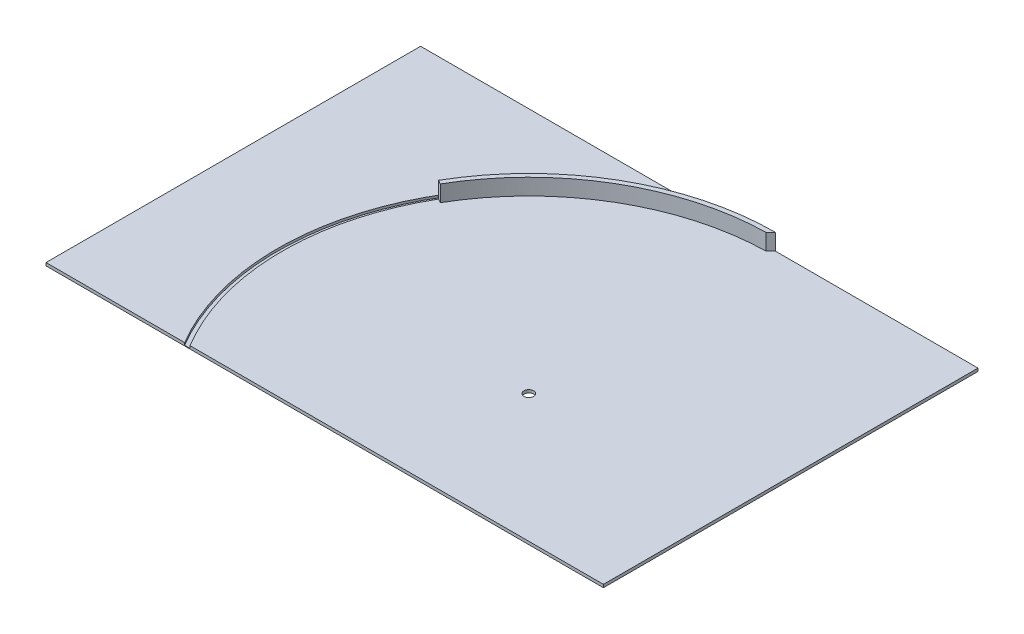
ISO-10303-21;
HEADER;
FILE_DESCRIPTION(('STEP AP214'),'2;1');
FILE_NAME('part.step','',(''),(''),'','','');
FILE_SCHEMA(('AUTOMOTIVE_DESIGN { 1 0 10303 214 1 1 1 1 }'));
ENDSEC;
DATA;
#1=APPLICATION_CONTEXT('core data for automotive mechanical design processes');
#2=APPLICATION_PROTOCOL_DEFINITION('international standard','automotive_design',2000,#1);
#3=PRODUCT_CONTEXT('',#1,'mechanical');
#4=PRODUCT('Part','Part','',(#3));
#5=PRODUCT_RELATED_PRODUCT_CATEGORY('part','',(#4));
#6=PRODUCT_DEFINITION_FORMATION('','',#4);
#7=PRODUCT_DEFINITION_CONTEXT('part definition',#1,'design');
#8=PRODUCT_DEFINITION('design','',#6,#7);
#9=PRODUCT_DEFINITION_SHAPE('','',#8);
#10=(LENGTH_UNIT() NAMED_UNIT(*) SI_UNIT(.MILLI.,.METRE.));
#11=(NAMED_UNIT(*) PLANE_ANGLE_UNIT() SI_UNIT($,.RADIAN.));
#12=(NAMED_UNIT(*) SI_UNIT($,.STERADIAN.) SOLID_ANGLE_UNIT());
#13=UNCERTAINTY_MEASURE_WITH_UNIT(LENGTH_MEASURE(1.E-05),#10,'distance_accuracy_value','');
#14=(GEOMETRIC_REPRESENTATION_CONTEXT(3) GLOBAL_UNCERTAINTY_ASSIGNED_CONTEXT((#13)) GLOBAL_UNIT_ASSIGNED_CONTEXT((#10,
#11,#12)) REPRESENTATION_CONTEXT('',''));
#15=CARTESIAN_POINT('',(0.,0.,0.));
#16=DIRECTION('',(0.,0.,1.));
#17=DIRECTION('',(1.,0.,0.));
#18=AXIS2_PLACEMENT_3D('',#15,#16,#17);
#19=CARTESIAN_POINT('',(0.,0.,0.));
#20=DIRECTION('',(0.,-1.,0.));
#21=DIRECTION('',(0.,0.,-1.));
#22=AXIS2_PLACEMENT_3D('',#19,#20,#21);
#23=PLANE('',#22);
#24=CARTESIAN_POINT('',(0.,0.,0.));
#25=DIRECTION('',(0.,1.,0.));
#26=DIRECTION('',(0.,0.,1.));
#27=AXIS2_PLACEMENT_3D('',#24,#25,#26);
#28=CIRCLE('',#27,10.5);
#29=CARTESIAN_POINT('',(0.,0.,10.5));
#30=VERTEX_POINT('',#29);
#31=EDGE_CURVE('E162',#30,#30,#28,.T.);
#32=ORIENTED_EDGE('',*,*,#31,.F.);
#33=EDGE_LOOP('',(#32));
#34=FACE_BOUND('',#33,.T.);
#35=DIRECTION('',(0.866025403784446,0.,0.499999999999987));
#36=VECTOR('',#35,1.);
#37=CARTESIAN_POINT('',(-459.859489409537,0.,-265.5));
#38=LINE('',#37,#36);
#39=CARTESIAN_POINT('',(-459.859489409537,0.,-265.5));
#40=VERTEX_POINT('',#39);
#41=CARTESIAN_POINT('',(-451.199235371692,0.,-260.5));
#42=VERTEX_POINT('',#41);
#43=EDGE_CURVE('E229',#40,#42,#38,.T.);
#44=ORIENTED_EDGE('',*,*,#43,.F.);
#45=CARTESIAN_POINT('',(0.,0.,0.));
#46=DIRECTION('',(0.,-1.,0.));
#47=DIRECTION('',(0.,0.,1.));
#48=AXIS2_PLACEMENT_3D('',#45,#46,#47);
#49=CIRCLE('',#48,531.);
#50=CARTESIAN_POINT('',(-453.999823788512,0.,275.4));
#51=VERTEX_POINT('',#50);
#52=EDGE_CURVE('E266',#51,#40,#49,.T.);
#53=ORIENTED_EDGE('',*,*,#52,.F.);
#54=DIRECTION('',(1.,0.,0.));
#55=VECTOR('',#54,1.);
#56=CARTESIAN_POINT('',(-764.07,0.,275.4));
#57=LINE('',#56,#55);
#58=CARTESIAN_POINT('',(435.93,0.,275.4));
#59=VERTEX_POINT('',#58);
#60=EDGE_CURVE('E198',#51,#59,#57,.T.);
#61=ORIENTED_EDGE('',*,*,#60,.T.);
#62=DIRECTION('',(0.,0.,-1.));
#63=VECTOR('',#62,1.);
#64=CARTESIAN_POINT('',(435.93,0.,275.4));
#65=LINE('',#64,#63);
#66=CARTESIAN_POINT('',(435.93,0.,-531.));
#67=VERTEX_POINT('',#66);
#68=EDGE_CURVE('E203',#59,#67,#65,.T.);
#69=ORIENTED_EDGE('',*,*,#68,.T.);
#70=DIRECTION('',(-1.,0.,0.));
#71=VECTOR('',#70,1.);
#72=CARTESIAN_POINT('',(-764.07,0.,-531.));
#73=LINE('',#72,#71);
#74=CARTESIAN_POINT('',(0.,0.,-531.));
#75=VERTEX_POINT('',#74);
#76=EDGE_CURVE('E182',#67,#75,#73,.T.);
#77=ORIENTED_EDGE('',*,*,#76,.T.);
#78=DIRECTION('',(0.707106781186547,0.,-0.707106781186548));
#79=VECTOR('',#78,1.);
#80=CARTESIAN_POINT('',(-265.5,0.,-265.5));
#81=LINE('',#80,#79);
#82=CARTESIAN_POINT('',(-10.0978661013188,0.,-520.902133898681));
#83=VERTEX_POINT('',#82);
#84=EDGE_CURVE('E55',#75,#83,#81,.F.);
#85=ORIENTED_EDGE('',*,*,#84,.T.);
#86=CARTESIAN_POINT('',(0.,0.,0.));
#87=DIRECTION('',(0.,-1.,0.));
#88=DIRECTION('',(0.,0.,1.));
#89=AXIS2_PLACEMENT_3D('',#86,#87,#88);
#90=CIRCLE('',#89,521.);
#91=EDGE_CURVE('E215',#42,#83,#90,.T.);
#92=ORIENTED_EDGE('',*,*,#91,.F.);
#93=EDGE_LOOP('',(#44,#53,#61,#69,#77,#85,#92));
#94=FACE_BOUND('',#93,.T.);
#95=ADVANCED_FACE('F45',(#34,#94),#23,.F.);
#96=CARTESIAN_POINT('',(0.,35.,0.));
#97=DIRECTION('',(0.,-1.,0.));
#98=DIRECTION('',(0.,0.,-1.));
#99=AXIS2_PLACEMENT_3D('',#96,#97,#98);
#100=CYLINDRICAL_SURFACE('',#99,521.);
#101=ORIENTED_EDGE('',*,*,#91,.T.);
#102=DIRECTION('',(0.,-1.,0.));
#103=VECTOR('',#102,1.);
#104=CARTESIAN_POINT('',(-10.0978661013188,35.,-520.902133898681));
#105=LINE('',#104,#103);
#106=CARTESIAN_POINT('',(-10.0978661013188,35.,-520.902133898681));
#107=VERTEX_POINT('',#106);
#108=EDGE_CURVE('E70',#83,#107,#105,.F.);
#109=ORIENTED_EDGE('',*,*,#108,.T.);
#110=CARTESIAN_POINT('',(0.,35.,0.));
#111=DIRECTION('',(0.,-1.,0.));
#112=DIRECTION('',(0.,0.,1.));
#113=AXIS2_PLACEMENT_3D('',#110,#111,#112);
#114=CIRCLE('',#113,521.);
#115=CARTESIAN_POINT('',(-451.199235371692,35.,-260.5));
#116=VERTEX_POINT('',#115);
#117=EDGE_CURVE('E225',#116,#107,#114,.T.);
#118=ORIENTED_EDGE('',*,*,#117,.F.);
#119=DIRECTION('',(0.,-1.,0.));
#120=VECTOR('',#119,1.);
#121=CARTESIAN_POINT('',(-451.199235371692,35.,-260.5));
#122=LINE('',#121,#120);
#123=EDGE_CURVE('E235',#116,#42,#122,.T.);
#124=ORIENTED_EDGE('',*,*,#123,.T.);
#125=EDGE_LOOP('',(#101,#109,#118,#124));
#126=FACE_BOUND('',#125,.T.);
#127=ADVANCED_FACE('F258',(#126),#100,.F.);
#128=CARTESIAN_POINT('',(0.,35.,0.));
#129=DIRECTION('',(0.,-1.,0.));
#130=DIRECTION('',(0.,0.,-1.));
#131=AXIS2_PLACEMENT_3D('',#128,#129,#130);
#132=CYLINDRICAL_SURFACE('',#131,531.);
#133=DIRECTION('',(0.,-1.,0.));
#134=VECTOR('',#133,1.);
#135=CARTESIAN_POINT('',(0.,35.,-531.));
#136=LINE('',#135,#134);
#137=CARTESIAN_POINT('',(0.,35.,-531.));
#138=VERTEX_POINT('',#137);
#139=EDGE_CURVE('E143',#138,#75,#136,.T.);
#140=ORIENTED_EDGE('',*,*,#139,.T.);
#141=DIRECTION('',(0.,1.,0.));
#142=VECTOR('',#141,1.);
#143=CARTESIAN_POINT('',(0.,-5.,-531.));
#144=LINE('',#143,#142);
#145=CARTESIAN_POINT('',(0.,-5.,-531.));
#146=VERTEX_POINT('',#145);
#147=EDGE_CURVE('E136',#146,#75,#144,.T.);
#148=ORIENTED_EDGE('',*,*,#147,.F.);
#149=CARTESIAN_POINT('',(0.,-5.,0.));
#150=DIRECTION('',(0.,-1.,0.));
#151=DIRECTION('',(0.,0.,1.));
#152=AXIS2_PLACEMENT_3D('',#149,#150,#151);
#153=CIRCLE('',#152,531.);
#154=CARTESIAN_POINT('',(-453.999823788512,-5.,275.4));
#155=VERTEX_POINT('',#154);
#156=EDGE_CURVE('E139',#155,#146,#153,.T.);
#157=ORIENTED_EDGE('',*,*,#156,.F.);
#158=DIRECTION('',(0.,1.,0.));
#159=VECTOR('',#158,1.);
#160=CARTESIAN_POINT('',(-453.999823788512,-5.,275.4));
#161=LINE('',#160,#159);
#162=EDGE_CURVE('E149',#155,#51,#161,.T.);
#163=ORIENTED_EDGE('',*,*,#162,.T.);
#164=ORIENTED_EDGE('',*,*,#52,.T.);
#165=DIRECTION('',(0.,-1.,0.));
#166=VECTOR('',#165,1.);
#167=CARTESIAN_POINT('',(-459.859489409537,35.,-265.500000000001));
#168=LINE('',#167,#166);
#169=CARTESIAN_POINT('',(-459.859489409537,35.,-265.500000000001));
#170=VERTEX_POINT('',#169);
#171=EDGE_CURVE('E244',#170,#40,#168,.T.);
#172=ORIENTED_EDGE('',*,*,#171,.F.);
#173=CARTESIAN_POINT('',(0.,35.,0.));
#174=DIRECTION('',(0.,1.,0.));
#175=DIRECTION('',(0.,0.,1.));
#176=AXIS2_PLACEMENT_3D('',#173,#174,#175);
#177=CIRCLE('',#176,531.);
#178=EDGE_CURVE('E228',#138,#170,#177,.T.);
#179=ORIENTED_EDGE('',*,*,#178,.F.);
#180=EDGE_LOOP('',(#140,#148,#157,#163,#164,#172,#179));
#181=FACE_BOUND('',#180,.T.);
#182=ADVANCED_FACE('F138',(#181),#132,.T.);
#183=CARTESIAN_POINT('',(-459.859489409537,35.,-265.5));
#184=DIRECTION('',(0.499999999999987,0.,-0.866025403784446));
#185=DIRECTION('',(-0.866025403784446,0.,-0.499999999999987));
#186=AXIS2_PLACEMENT_3D('',#183,#184,#185);
#187=PLANE('',#186);
#188=ORIENTED_EDGE('',*,*,#43,.T.);
#189=ORIENTED_EDGE('',*,*,#123,.F.);
#190=DIRECTION('',(0.866025403784446,0.,0.499999999999987));
#191=VECTOR('',#190,1.);
#192=CARTESIAN_POINT('',(-459.859489409537,35.,-265.5));
#193=LINE('',#192,#191);
#194=EDGE_CURVE('E232',#170,#116,#193,.T.);
#195=ORIENTED_EDGE('',*,*,#194,.F.);
#196=ORIENTED_EDGE('',*,*,#171,.T.);
#197=EDGE_LOOP('',(#188,#189,#195,#196));
#198=FACE_BOUND('',#197,.T.);
#199=ADVANCED_FACE('F268',(#198),#187,.F.);
#200=CARTESIAN_POINT('',(0.,35.,0.));
#201=DIRECTION('',(0.,1.,0.));
#202=DIRECTION('',(0.,0.,1.));
#203=AXIS2_PLACEMENT_3D('',#200,#201,#202);
#204=PLANE('',#203);
#205=ORIENTED_EDGE('',*,*,#117,.T.);
#206=DIRECTION('',(-0.707106781186547,0.,0.707106781186548));
#207=VECTOR('',#206,1.);
#208=CARTESIAN_POINT('',(-265.5,35.,-265.5));
#209=LINE('',#208,#207);
#210=EDGE_CURVE('E252',#107,#138,#209,.F.);
#211=ORIENTED_EDGE('',*,*,#210,.T.);
#212=ORIENTED_EDGE('',*,*,#178,.T.);
#213=ORIENTED_EDGE('',*,*,#194,.T.);
#214=EDGE_LOOP('',(#205,#211,#212,#213));
#215=FACE_BOUND('',#214,.T.);
#216=ADVANCED_FACE('F262',(#215),#204,.T.);
#217=CARTESIAN_POINT('',(-764.07,-6.35,275.4));
#218=DIRECTION('',(-1.,0.,0.));
#219=DIRECTION('',(0.,0.,1.));
#220=AXIS2_PLACEMENT_3D('',#217,#218,#219);
#221=PLANE('',#220);
#222=DIRECTION('',(0.,0.,1.));
#223=VECTOR('',#222,1.);
#224=CARTESIAN_POINT('',(-764.07,0.,275.4));
#225=LINE('',#224,#223);
#226=CARTESIAN_POINT('',(-764.07,0.,-531.));
#227=VERTEX_POINT('',#226);
#228=CARTESIAN_POINT('',(-764.07,0.,275.4));
#229=VERTEX_POINT('',#228);
#230=EDGE_CURVE('E176',#227,#229,#225,.T.);
#231=ORIENTED_EDGE('',*,*,#230,.F.);
#232=DIRECTION('',(0.,1.,0.));
#233=VECTOR('',#232,1.);
#234=CARTESIAN_POINT('',(-764.07,-6.35,-531.));
#235=LINE('',#234,#233);
#236=CARTESIAN_POINT('',(-764.07,-6.35,-531.));
#237=VERTEX_POINT('',#236);
#238=EDGE_CURVE('E211',#237,#227,#235,.T.);
#239=ORIENTED_EDGE('',*,*,#238,.F.);
#240=DIRECTION('',(0.,0.,1.));
#241=VECTOR('',#240,1.);
#242=CARTESIAN_POINT('',(-764.07,-6.35,275.4));
#243=LINE('',#242,#241);
#244=CARTESIAN_POINT('',(-764.07,-6.35,275.4));
#245=VERTEX_POINT('',#244);
#246=EDGE_CURVE('E177',#237,#245,#243,.T.);
#247=ORIENTED_EDGE('',*,*,#246,.T.);
#248=DIRECTION('',(0.,1.,0.));
#249=VECTOR('',#248,1.);
#250=CARTESIAN_POINT('',(-764.07,-6.35,275.4));
#251=LINE('',#250,#249);
#252=EDGE_CURVE('E194',#245,#229,#251,.T.);
#253=ORIENTED_EDGE('',*,*,#252,.T.);
#254=EDGE_LOOP('',(#231,#239,#247,#253));
#255=FACE_BOUND('',#254,.T.);
#256=ADVANCED_FACE('F283',(#255),#221,.T.);
#257=CARTESIAN_POINT('',(-764.07,-6.35,-531.));
#258=DIRECTION('',(0.,0.,-1.));
#259=DIRECTION('',(-1.,0.,0.));
#260=AXIS2_PLACEMENT_3D('',#257,#258,#259);
#261=PLANE('',#260);
#262=DIRECTION('',(0.,1.,0.));
#263=VECTOR('',#262,1.);
#264=CARTESIAN_POINT('',(-103.537432844358,-5.,-531.));
#265=LINE('',#264,#263);
#266=CARTESIAN_POINT('',(-103.537432844358,-5.,-531.));
#267=VERTEX_POINT('',#266);
#268=CARTESIAN_POINT('',(-103.537432844358,0.,-531.));
#269=VERTEX_POINT('',#268);
#270=EDGE_CURVE('E62',#267,#269,#265,.T.);
#271=ORIENTED_EDGE('',*,*,#270,.F.);
#272=DIRECTION('',(1.,0.,0.));
#273=VECTOR('',#272,1.);
#274=CARTESIAN_POINT('',(-764.07,-5.,-531.));
#275=LINE('',#274,#273);
#276=EDGE_CURVE('E155',#267,#146,#275,.T.);
#277=ORIENTED_EDGE('',*,*,#276,.T.);
#278=ORIENTED_EDGE('',*,*,#147,.T.);
#279=ORIENTED_EDGE('',*,*,#76,.F.);
#280=DIRECTION('',(0.,1.,0.));
#281=VECTOR('',#280,1.);
#282=CARTESIAN_POINT('',(435.93,-6.35,-531.));
#283=LINE('',#282,#281);
#284=CARTESIAN_POINT('',(435.93,-6.35,-531.));
#285=VERTEX_POINT('',#284);
#286=EDGE_CURVE('E216',#285,#67,#283,.T.);
#287=ORIENTED_EDGE('',*,*,#286,.F.);
#288=DIRECTION('',(-1.,0.,0.));
#289=VECTOR('',#288,1.);
#290=CARTESIAN_POINT('',(-764.07,-6.35,-531.));
#291=LINE('',#290,#289);
#292=EDGE_CURVE('E190',#285,#237,#291,.T.);
#293=ORIENTED_EDGE('',*,*,#292,.T.);
#294=ORIENTED_EDGE('',*,*,#238,.T.);
#295=EDGE_CURVE('E207',#269,#227,#73,.T.);
#296=ORIENTED_EDGE('',*,*,#295,.F.);
#297=EDGE_LOOP('',(#271,#277,#278,#279,#287,#293,#294,#296));
#298=FACE_BOUND('',#297,.T.);
#299=ADVANCED_FACE('F159',(#298),#261,.T.);
#300=CARTESIAN_POINT('',(435.93,-6.35,275.4));
#301=DIRECTION('',(1.,0.,0.));
#302=DIRECTION('',(0.,0.,-1.));
#303=AXIS2_PLACEMENT_3D('',#300,#301,#302);
#304=PLANE('',#303);
#305=ORIENTED_EDGE('',*,*,#68,.F.);
#306=DIRECTION('',(0.,1.,0.));
#307=VECTOR('',#306,1.);
#308=CARTESIAN_POINT('',(435.93,-6.35,275.4));
#309=LINE('',#308,#307);
#310=CARTESIAN_POINT('',(435.93,-6.35,275.4));
#311=VERTEX_POINT('',#310);
#312=EDGE_CURVE('E219',#311,#59,#309,.T.);
#313=ORIENTED_EDGE('',*,*,#312,.F.);
#314=DIRECTION('',(0.,0.,-1.));
#315=VECTOR('',#314,1.);
#316=CARTESIAN_POINT('',(435.93,-6.35,275.4));
#317=LINE('',#316,#315);
#318=EDGE_CURVE('E186',#311,#285,#317,.T.);
#319=ORIENTED_EDGE('',*,*,#318,.T.);
#320=ORIENTED_EDGE('',*,*,#286,.T.);
#321=EDGE_LOOP('',(#305,#313,#319,#320));
#322=FACE_BOUND('',#321,.T.);
#323=ADVANCED_FACE('F324',(#322),#304,.T.);
#324=CARTESIAN_POINT('',(-764.07,-6.35,275.4));
#325=DIRECTION('',(0.,0.,1.));
#326=DIRECTION('',(1.,0.,0.));
#327=AXIS2_PLACEMENT_3D('',#324,#325,#326);
#328=PLANE('',#327);
#329=ORIENTED_EDGE('',*,*,#162,.F.);
#330=DIRECTION('',(-1.,0.,0.));
#331=VECTOR('',#330,1.);
#332=CARTESIAN_POINT('',(-764.07,-5.,275.4));
#333=LINE('',#332,#331);
#334=CARTESIAN_POINT('',(-465.656353977909,-5.,275.4));
#335=VERTEX_POINT('',#334);
#336=EDGE_CURVE('E11',#155,#335,#333,.T.);
#337=ORIENTED_EDGE('',*,*,#336,.T.);
#338=DIRECTION('',(0.,1.,0.));
#339=VECTOR('',#338,1.);
#340=CARTESIAN_POINT('',(-465.656353977909,-5.,275.4));
#341=LINE('',#340,#339);
#342=CARTESIAN_POINT('',(-465.656353977909,0.,275.4));
#343=VERTEX_POINT('',#342);
#344=EDGE_CURVE('E169',#343,#335,#341,.F.);
#345=ORIENTED_EDGE('',*,*,#344,.F.);
#346=EDGE_CURVE('E199',#229,#343,#57,.T.);
#347=ORIENTED_EDGE('',*,*,#346,.F.);
#348=ORIENTED_EDGE('',*,*,#252,.F.);
#349=DIRECTION('',(1.,0.,0.));
#350=VECTOR('',#349,1.);
#351=CARTESIAN_POINT('',(-764.07,-6.35,275.4));
#352=LINE('',#351,#350);
#353=EDGE_CURVE('E181',#245,#311,#352,.T.);
#354=ORIENTED_EDGE('',*,*,#353,.T.);
#355=ORIENTED_EDGE('',*,*,#312,.T.);
#356=ORIENTED_EDGE('',*,*,#60,.F.);
#357=EDGE_LOOP('',(#329,#337,#345,#347,#348,#354,#355,#356));
#358=FACE_BOUND('',#357,.T.);
#359=ADVANCED_FACE('F273',(#358),#328,.T.);
#360=CARTESIAN_POINT('',(0.,-6.35,0.));
#361=DIRECTION('',(0.,-1.,0.));
#362=DIRECTION('',(0.,0.,-1.));
#363=AXIS2_PLACEMENT_3D('',#360,#361,#362);
#364=PLANE('',#363);
#365=CARTESIAN_POINT('',(0.,-6.35,0.));
#366=DIRECTION('',(0.,1.,0.));
#367=DIRECTION('',(0.,0.,1.));
#368=AXIS2_PLACEMENT_3D('',#365,#366,#367);
#369=CIRCLE('',#368,10.5);
#370=CARTESIAN_POINT('',(0.,-6.35,10.5));
#371=VERTEX_POINT('',#370);
#372=EDGE_CURVE('E167',#371,#371,#369,.T.);
#373=ORIENTED_EDGE('',*,*,#372,.T.);
#374=EDGE_LOOP('',(#373));
#375=FACE_BOUND('',#374,.T.);
#376=ORIENTED_EDGE('',*,*,#246,.F.);
#377=ORIENTED_EDGE('',*,*,#292,.F.);
#378=ORIENTED_EDGE('',*,*,#318,.F.);
#379=ORIENTED_EDGE('',*,*,#353,.F.);
#380=EDGE_LOOP('',(#376,#377,#378,#379));
#381=FACE_BOUND('',#380,.T.);
#382=ADVANCED_FACE('F315',(#375,#381),#364,.T.);
#383=ORIENTED_EDGE('',*,*,#346,.T.);
#384=CARTESIAN_POINT('',(0.,0.,0.));
#385=DIRECTION('',(0.,1.,0.));
#386=DIRECTION('',(0.,0.,1.));
#387=AXIS2_PLACEMENT_3D('',#384,#385,#386);
#388=CIRCLE('',#387,541.);
#389=EDGE_CURVE('E157',#269,#343,#388,.T.);
#390=ORIENTED_EDGE('',*,*,#389,.F.);
#391=ORIENTED_EDGE('',*,*,#295,.T.);
#392=ORIENTED_EDGE('',*,*,#230,.T.);
#393=EDGE_LOOP('',(#383,#390,#391,#392));
#394=FACE_BOUND('',#393,.T.);
#395=ADVANCED_FACE('F278',(#394),#23,.F.);
#396=CARTESIAN_POINT('',(0.,35.,-531.));
#397=DIRECTION('',(-0.707106781186548,0.,-0.707106781186547));
#398=DIRECTION('',(0.,-1.,0.));
#399=AXIS2_PLACEMENT_3D('',#396,#397,#398);
#400=PLANE('',#399);
#401=ORIENTED_EDGE('',*,*,#210,.F.);
#402=ORIENTED_EDGE('',*,*,#108,.F.);
#403=ORIENTED_EDGE('',*,*,#84,.F.);
#404=ORIENTED_EDGE('',*,*,#139,.F.);
#405=EDGE_LOOP('',(#401,#402,#403,#404));
#406=FACE_BOUND('',#405,.T.);
#407=ADVANCED_FACE('F48',(#406),#400,.F.);
#408=CARTESIAN_POINT('',(0.,0.,0.));
#409=DIRECTION('',(0.,1.,0.));
#410=DIRECTION('',(0.,0.,1.));
#411=AXIS2_PLACEMENT_3D('',#408,#409,#410);
#412=CYLINDRICAL_SURFACE('',#411,10.5);
#413=ORIENTED_EDGE('',*,*,#372,.F.);
#414=EDGE_LOOP('',(#413));
#415=FACE_BOUND('',#414,.T.);
#416=ORIENTED_EDGE('',*,*,#31,.T.);
#417=EDGE_LOOP('',(#416));
#418=FACE_BOUND('',#417,.T.);
#419=ADVANCED_FACE('F296',(#415,#418),#412,.F.);
#420=CARTESIAN_POINT('',(0.,-5.,0.));
#421=DIRECTION('',(0.,1.,0.));
#422=DIRECTION('',(0.,0.,1.));
#423=AXIS2_PLACEMENT_3D('',#420,#421,#422);
#424=CYLINDRICAL_SURFACE('',#423,541.);
#425=ORIENTED_EDGE('',*,*,#270,.T.);
#426=ORIENTED_EDGE('',*,*,#389,.T.);
#427=ORIENTED_EDGE('',*,*,#344,.T.);
#428=CARTESIAN_POINT('',(0.,-5.,0.));
#429=DIRECTION('',(0.,1.,0.));
#430=DIRECTION('',(0.,0.,1.));
#431=AXIS2_PLACEMENT_3D('',#428,#429,#430);
#432=CIRCLE('',#431,541.);
#433=EDGE_CURVE('E150',#267,#335,#432,.T.);
#434=ORIENTED_EDGE('',*,*,#433,.F.);
#435=EDGE_LOOP('',(#425,#426,#427,#434));
#436=FACE_BOUND('',#435,.T.);
#437=ADVANCED_FACE('F294',(#436),#424,.F.);
#438=CARTESIAN_POINT('',(0.,-5.,0.));
#439=DIRECTION('',(0.,1.,0.));
#440=DIRECTION('',(0.,0.,1.));
#441=AXIS2_PLACEMENT_3D('',#438,#439,#440);
#442=PLANE('',#441);
#443=ORIENTED_EDGE('',*,*,#433,.T.);
#444=ORIENTED_EDGE('',*,*,#336,.F.);
#445=ORIENTED_EDGE('',*,*,#156,.T.);
#446=ORIENTED_EDGE('',*,*,#276,.F.);
#447=EDGE_LOOP('',(#443,#444,#445,#446));
#448=FACE_BOUND('',#447,.T.);
#449=ADVANCED_FACE('F154',(#448),#442,.T.);
#450=CLOSED_SHELL('',(#95,#127,#182,#199,#216,#256,#299,#323,#359,#382,#395,#407,#419,#437,#449));
#451=MANIFOLD_SOLID_BREP('B2',#450);
#452=ADVANCED_BREP_SHAPE_REPRESENTATION('',(#18,#451),#14);
#453=SHAPE_DEFINITION_REPRESENTATION(#9,#452);
ENDSEC;
END-ISO-10303-21;
